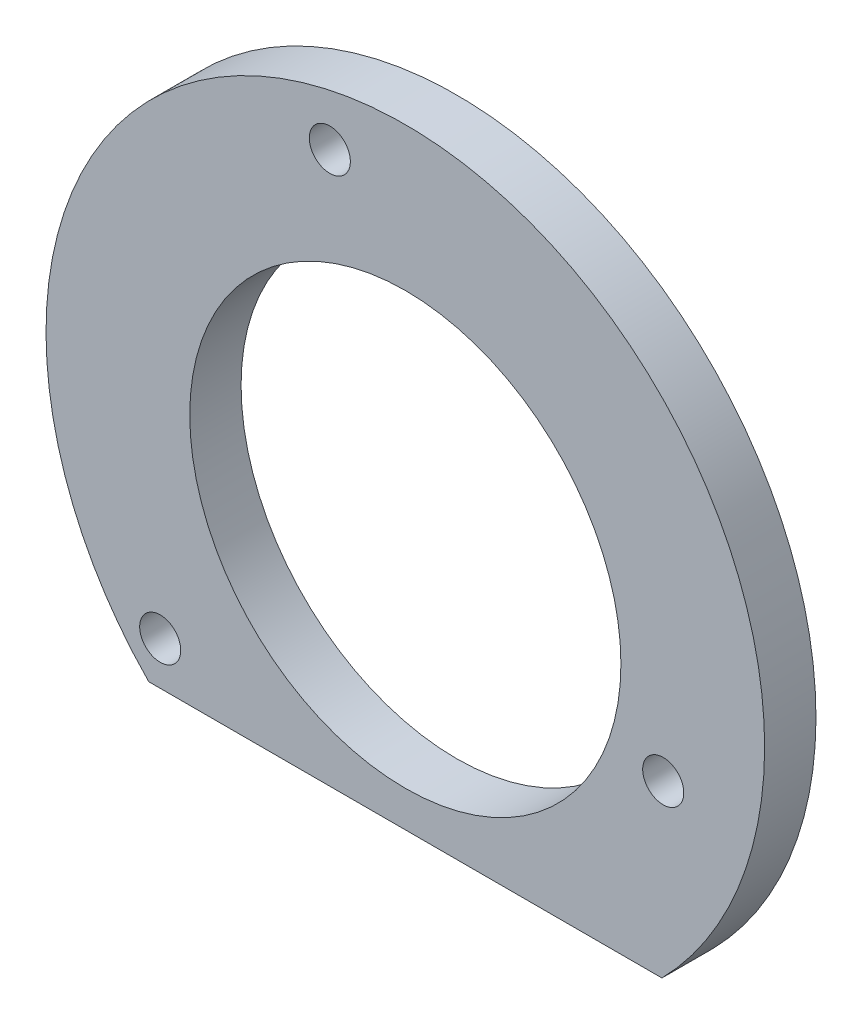
ISO-10303-21;
HEADER;
FILE_DESCRIPTION(('STEP AP214'),'2;1');
FILE_NAME('part.step','',(''),(''),'','','');
FILE_SCHEMA(('AUTOMOTIVE_DESIGN { 1 0 10303 214 1 1 1 1 }'));
ENDSEC;
DATA;
#1=APPLICATION_CONTEXT('core data for automotive mechanical design processes');
#2=APPLICATION_PROTOCOL_DEFINITION('international standard','automotive_design',2000,#1);
#3=PRODUCT_CONTEXT('',#1,'mechanical');
#4=PRODUCT('Part','Part','',(#3));
#5=PRODUCT_RELATED_PRODUCT_CATEGORY('part','',(#4));
#6=PRODUCT_DEFINITION_FORMATION('','',#4);
#7=PRODUCT_DEFINITION_CONTEXT('part definition',#1,'design');
#8=PRODUCT_DEFINITION('design','',#6,#7);
#9=PRODUCT_DEFINITION_SHAPE('','',#8);
#10=(LENGTH_UNIT() NAMED_UNIT(*) SI_UNIT(.MILLI.,.METRE.));
#11=(NAMED_UNIT(*) PLANE_ANGLE_UNIT() SI_UNIT($,.RADIAN.));
#12=(NAMED_UNIT(*) SI_UNIT($,.STERADIAN.) SOLID_ANGLE_UNIT());
#13=UNCERTAINTY_MEASURE_WITH_UNIT(LENGTH_MEASURE(1.E-05),#10,'distance_accuracy_value','');
#14=(GEOMETRIC_REPRESENTATION_CONTEXT(3) GLOBAL_UNCERTAINTY_ASSIGNED_CONTEXT((#13)) GLOBAL_UNIT_ASSIGNED_CONTEXT((#10,
#11,#12)) REPRESENTATION_CONTEXT('',''));
#15=CARTESIAN_POINT('',(0.,0.,0.));
#16=DIRECTION('',(0.,0.,1.));
#17=DIRECTION('',(1.,0.,0.));
#18=AXIS2_PLACEMENT_3D('',#15,#16,#17);
#19=CARTESIAN_POINT('',(0.,0.,5.08));
#20=DIRECTION('',(0.,0.,-1.));
#21=DIRECTION('',(-1.,0.,0.));
#22=AXIS2_PLACEMENT_3D('',#19,#20,#21);
#23=CYLINDRICAL_SURFACE('',#22,35.56);
#24=CARTESIAN_POINT('',(0.,0.,5.08));
#25=DIRECTION('',(0.,0.,1.));
#26=DIRECTION('',(1.,0.,0.));
#27=AXIS2_PLACEMENT_3D('',#24,#25,#26);
#28=CIRCLE('',#27,35.56);
#29=CARTESIAN_POINT('',(25.3949194918984,-24.892,5.08));
#30=VERTEX_POINT('',#29);
#31=CARTESIAN_POINT('',(-25.3949194918984,-24.892,5.08));
#32=VERTEX_POINT('',#31);
#33=EDGE_CURVE('E39',#30,#32,#28,.T.);
#34=ORIENTED_EDGE('',*,*,#33,.F.);
#35=DIRECTION('',(0.,0.,-1.));
#36=VECTOR('',#35,1.);
#37=CARTESIAN_POINT('',(25.3949194918984,-24.892,5.08));
#38=LINE('',#37,#36);
#39=CARTESIAN_POINT('',(25.3949194918984,-24.892,0.));
#40=VERTEX_POINT('',#39);
#41=EDGE_CURVE('E53',#30,#40,#38,.T.);
#42=ORIENTED_EDGE('',*,*,#41,.T.);
#43=CARTESIAN_POINT('',(0.,0.,0.));
#44=DIRECTION('',(0.,0.,1.));
#45=DIRECTION('',(1.,0.,0.));
#46=AXIS2_PLACEMENT_3D('',#43,#44,#45);
#47=CIRCLE('',#46,35.56);
#48=CARTESIAN_POINT('',(-25.3949194918984,-24.892,0.));
#49=VERTEX_POINT('',#48);
#50=EDGE_CURVE('E61',#40,#49,#47,.T.);
#51=ORIENTED_EDGE('',*,*,#50,.T.);
#52=DIRECTION('',(0.,0.,-1.));
#53=VECTOR('',#52,1.);
#54=CARTESIAN_POINT('',(-25.3949194918984,-24.892,5.08));
#55=LINE('',#54,#53);
#56=EDGE_CURVE('E46',#49,#32,#55,.F.);
#57=ORIENTED_EDGE('',*,*,#56,.T.);
#58=EDGE_LOOP('',(#34,#42,#51,#57));
#59=FACE_BOUND('',#58,.T.);
#60=ADVANCED_FACE('F32',(#59),#23,.T.);
#61=CARTESIAN_POINT('',(0.,0.,5.08));
#62=DIRECTION('',(0.,0.,1.));
#63=DIRECTION('',(1.,0.,0.));
#64=AXIS2_PLACEMENT_3D('',#61,#62,#63);
#65=PLANE('',#64);
#66=CARTESIAN_POINT('',(0.,0.,5.08));
#67=DIRECTION('',(0.,0.,-1.));
#68=DIRECTION('',(-1.,0.,0.));
#69=AXIS2_PLACEMENT_3D('',#66,#67,#68);
#70=CIRCLE('',#69,21.336);
#71=CARTESIAN_POINT('',(-21.336,0.,5.08));
#72=VERTEX_POINT('',#71);
#73=EDGE_CURVE('E75',#72,#72,#70,.T.);
#74=ORIENTED_EDGE('',*,*,#73,.T.);
#75=EDGE_LOOP('',(#74));
#76=FACE_BOUND('',#75,.T.);
#77=CARTESIAN_POINT('',(-24.2610998869317,-20.6264765028923,5.08));
#78=DIRECTION('',(0.,0.,1.));
#79=DIRECTION('',(1.,0.,0.));
#80=AXIS2_PLACEMENT_3D('',#77,#78,#79);
#81=CIRCLE('',#80,2.032);
#82=CARTESIAN_POINT('',(-22.2290998869317,-20.6264765028923,5.08));
#83=VERTEX_POINT('',#82);
#84=EDGE_CURVE('E84',#83,#83,#81,.T.);
#85=ORIENTED_EDGE('',*,*,#84,.F.);
#86=EDGE_LOOP('',(#85));
#87=FACE_BOUND('',#86,.T.);
#88=CARTESIAN_POINT('',(-7.47196911393405,29.6655234971077,5.08));
#89=DIRECTION('',(0.,0.,1.));
#90=DIRECTION('',(1.,0.,0.));
#91=AXIS2_PLACEMENT_3D('',#88,#89,#90);
#92=CIRCLE('',#91,2.032);
#93=CARTESIAN_POINT('',(-5.43996911393405,29.6655234971077,5.08));
#94=VERTEX_POINT('',#93);
#95=EDGE_CURVE('E78',#94,#94,#92,.T.);
#96=ORIENTED_EDGE('',*,*,#95,.F.);
#97=EDGE_LOOP('',(#96));
#98=FACE_BOUND('',#97,.T.);
#99=CARTESIAN_POINT('',(25.5229001130683,-7.95282373789202,5.08));
#100=DIRECTION('',(0.,0.,1.));
#101=DIRECTION('',(1.,0.,0.));
#102=AXIS2_PLACEMENT_3D('',#99,#100,#101);
#103=CIRCLE('',#102,2.032);
#104=CARTESIAN_POINT('',(27.5549001130683,-7.95282373789202,5.08));
#105=VERTEX_POINT('',#104);
#106=EDGE_CURVE('E71',#105,#105,#103,.T.);
#107=ORIENTED_EDGE('',*,*,#106,.F.);
#108=EDGE_LOOP('',(#107));
#109=FACE_BOUND('',#108,.T.);
#110=DIRECTION('',(-1.,0.,0.));
#111=VECTOR('',#110,1.);
#112=CARTESIAN_POINT('',(-36.2560555223226,-24.892,5.08));
#113=LINE('',#112,#111);
#114=EDGE_CURVE('E56',#30,#32,#113,.T.);
#115=ORIENTED_EDGE('',*,*,#114,.F.);
#116=ORIENTED_EDGE('',*,*,#33,.T.);
#117=EDGE_LOOP('',(#115,#116));
#118=FACE_BOUND('',#117,.T.);
#119=ADVANCED_FACE('F65',(#76,#87,#98,#109,#118),#65,.T.);
#120=CARTESIAN_POINT('',(0.,0.,0.));
#121=DIRECTION('',(0.,0.,1.));
#122=DIRECTION('',(1.,0.,0.));
#123=AXIS2_PLACEMENT_3D('',#120,#121,#122);
#124=PLANE('',#123);
#125=CARTESIAN_POINT('',(0.,0.,0.));
#126=DIRECTION('',(0.,0.,-1.));
#127=DIRECTION('',(-1.,0.,0.));
#128=AXIS2_PLACEMENT_3D('',#125,#126,#127);
#129=CIRCLE('',#128,21.336);
#130=CARTESIAN_POINT('',(-21.336,0.,0.));
#131=VERTEX_POINT('',#130);
#132=EDGE_CURVE('E89',#131,#131,#129,.T.);
#133=ORIENTED_EDGE('',*,*,#132,.F.);
#134=EDGE_LOOP('',(#133));
#135=FACE_BOUND('',#134,.T.);
#136=CARTESIAN_POINT('',(-24.2610998869317,-20.6264765028923,0.));
#137=DIRECTION('',(0.,0.,1.));
#138=DIRECTION('',(1.,0.,0.));
#139=AXIS2_PLACEMENT_3D('',#136,#137,#138);
#140=CIRCLE('',#139,2.032);
#141=CARTESIAN_POINT('',(-22.2290998869317,-20.6264765028923,0.));
#142=VERTEX_POINT('',#141);
#143=EDGE_CURVE('E66',#142,#142,#140,.T.);
#144=ORIENTED_EDGE('',*,*,#143,.T.);
#145=EDGE_LOOP('',(#144));
#146=FACE_BOUND('',#145,.T.);
#147=CARTESIAN_POINT('',(-7.47196911393405,29.6655234971077,0.));
#148=DIRECTION('',(0.,0.,1.));
#149=DIRECTION('',(1.,0.,0.));
#150=AXIS2_PLACEMENT_3D('',#147,#148,#149);
#151=CIRCLE('',#150,2.032);
#152=CARTESIAN_POINT('',(-5.43996911393405,29.6655234971077,0.));
#153=VERTEX_POINT('',#152);
#154=EDGE_CURVE('E81',#153,#153,#151,.T.);
#155=ORIENTED_EDGE('',*,*,#154,.T.);
#156=EDGE_LOOP('',(#155));
#157=FACE_BOUND('',#156,.T.);
#158=CARTESIAN_POINT('',(25.5229001130683,-7.95282373789202,0.));
#159=DIRECTION('',(0.,0.,1.));
#160=DIRECTION('',(1.,0.,0.));
#161=AXIS2_PLACEMENT_3D('',#158,#159,#160);
#162=CIRCLE('',#161,2.032);
#163=CARTESIAN_POINT('',(27.5549001130683,-7.95282373789202,0.));
#164=VERTEX_POINT('',#163);
#165=EDGE_CURVE('E74',#164,#164,#162,.T.);
#166=ORIENTED_EDGE('',*,*,#165,.T.);
#167=EDGE_LOOP('',(#166));
#168=FACE_BOUND('',#167,.T.);
#169=ORIENTED_EDGE('',*,*,#50,.F.);
#170=DIRECTION('',(-1.,0.,0.));
#171=VECTOR('',#170,1.);
#172=CARTESIAN_POINT('',(0.,-24.892,0.));
#173=LINE('',#172,#171);
#174=EDGE_CURVE('E11',#40,#49,#173,.T.);
#175=ORIENTED_EDGE('',*,*,#174,.T.);
#176=EDGE_LOOP('',(#169,#175));
#177=FACE_BOUND('',#176,.T.);
#178=ADVANCED_FACE('F104',(#135,#146,#157,#168,#177),#124,.F.);
#179=CARTESIAN_POINT('',(-36.2560555223226,-24.892,0.));
#180=DIRECTION('',(0.,1.,0.));
#181=DIRECTION('',(0.,0.,1.));
#182=AXIS2_PLACEMENT_3D('',#179,#180,#181);
#183=PLANE('',#182);
#184=ORIENTED_EDGE('',*,*,#114,.T.);
#185=ORIENTED_EDGE('',*,*,#56,.F.);
#186=ORIENTED_EDGE('',*,*,#174,.F.);
#187=ORIENTED_EDGE('',*,*,#41,.F.);
#188=EDGE_LOOP('',(#184,#185,#186,#187));
#189=FACE_BOUND('',#188,.T.);
#190=ADVANCED_FACE('F55',(#189),#183,.F.);
#191=CARTESIAN_POINT('',(25.5229001130683,-7.95282373789202,0.));
#192=DIRECTION('',(0.,0.,1.));
#193=DIRECTION('',(1.,0.,0.));
#194=AXIS2_PLACEMENT_3D('',#191,#192,#193);
#195=CYLINDRICAL_SURFACE('',#194,2.032);
#196=ORIENTED_EDGE('',*,*,#165,.F.);
#197=EDGE_LOOP('',(#196));
#198=FACE_BOUND('',#197,.T.);
#199=ORIENTED_EDGE('',*,*,#106,.T.);
#200=EDGE_LOOP('',(#199));
#201=FACE_BOUND('',#200,.T.);
#202=ADVANCED_FACE('F114',(#198,#201),#195,.F.);
#203=CARTESIAN_POINT('',(-7.47196911393405,29.6655234971077,0.));
#204=DIRECTION('',(0.,0.,1.));
#205=DIRECTION('',(1.,0.,0.));
#206=AXIS2_PLACEMENT_3D('',#203,#204,#205);
#207=CYLINDRICAL_SURFACE('',#206,2.032);
#208=ORIENTED_EDGE('',*,*,#154,.F.);
#209=EDGE_LOOP('',(#208));
#210=FACE_BOUND('',#209,.T.);
#211=ORIENTED_EDGE('',*,*,#95,.T.);
#212=EDGE_LOOP('',(#211));
#213=FACE_BOUND('',#212,.T.);
#214=ADVANCED_FACE('F117',(#210,#213),#207,.F.);
#215=CARTESIAN_POINT('',(-24.2610998869317,-20.6264765028923,0.));
#216=DIRECTION('',(0.,0.,1.));
#217=DIRECTION('',(1.,0.,0.));
#218=AXIS2_PLACEMENT_3D('',#215,#216,#217);
#219=CYLINDRICAL_SURFACE('',#218,2.032);
#220=ORIENTED_EDGE('',*,*,#143,.F.);
#221=EDGE_LOOP('',(#220));
#222=FACE_BOUND('',#221,.T.);
#223=ORIENTED_EDGE('',*,*,#84,.T.);
#224=EDGE_LOOP('',(#223));
#225=FACE_BOUND('',#224,.T.);
#226=ADVANCED_FACE('F100',(#222,#225),#219,.F.);
#227=CARTESIAN_POINT('',(0.,0.,5.08));
#228=DIRECTION('',(0.,0.,-1.));
#229=DIRECTION('',(-1.,0.,0.));
#230=AXIS2_PLACEMENT_3D('',#227,#228,#229);
#231=CYLINDRICAL_SURFACE('',#230,21.336);
#232=ORIENTED_EDGE('',*,*,#73,.F.);
#233=EDGE_LOOP('',(#232));
#234=FACE_BOUND('',#233,.T.);
#235=ORIENTED_EDGE('',*,*,#132,.T.);
#236=EDGE_LOOP('',(#235));
#237=FACE_BOUND('',#236,.T.);
#238=ADVANCED_FACE('F97',(#234,#237),#231,.F.);
#239=CLOSED_SHELL('',(#60,#119,#178,#190,#202,#214,#226,#238));
#240=MANIFOLD_SOLID_BREP('B2',#239);
#241=ADVANCED_BREP_SHAPE_REPRESENTATION('',(#18,#240),#14);
#242=SHAPE_DEFINITION_REPRESENTATION(#9,#241);
ENDSEC;
END-ISO-10303-21;
